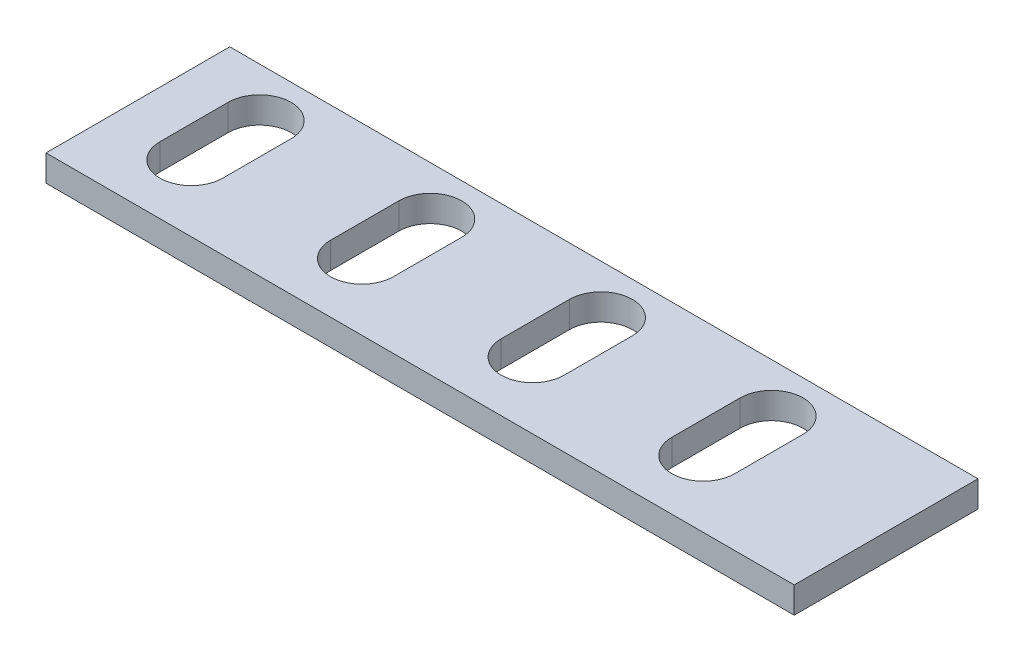
ISO-10303-21;
HEADER;
FILE_DESCRIPTION(('STEP AP214'),'2;1');
FILE_NAME('part.step','',(''),(''),'','','');
FILE_SCHEMA(('AUTOMOTIVE_DESIGN { 1 0 10303 214 1 1 1 1 }'));
ENDSEC;
DATA;
#1=APPLICATION_CONTEXT('core data for automotive mechanical design processes');
#2=APPLICATION_PROTOCOL_DEFINITION('international standard','automotive_design',2000,#1);
#3=PRODUCT_CONTEXT('',#1,'mechanical');
#4=PRODUCT('Part','Part','',(#3));
#5=PRODUCT_RELATED_PRODUCT_CATEGORY('part','',(#4));
#6=PRODUCT_DEFINITION_FORMATION('','',#4);
#7=PRODUCT_DEFINITION_CONTEXT('part definition',#1,'design');
#8=PRODUCT_DEFINITION('design','',#6,#7);
#9=PRODUCT_DEFINITION_SHAPE('','',#8);
#10=(LENGTH_UNIT() NAMED_UNIT(*) SI_UNIT(.MILLI.,.METRE.));
#11=(NAMED_UNIT(*) PLANE_ANGLE_UNIT() SI_UNIT($,.RADIAN.));
#12=(NAMED_UNIT(*) SI_UNIT($,.STERADIAN.) SOLID_ANGLE_UNIT());
#13=UNCERTAINTY_MEASURE_WITH_UNIT(LENGTH_MEASURE(1.E-05),#10,'distance_accuracy_value','');
#14=(GEOMETRIC_REPRESENTATION_CONTEXT(3) GLOBAL_UNCERTAINTY_ASSIGNED_CONTEXT((#13)) GLOBAL_UNIT_ASSIGNED_CONTEXT((#10,
#11,#12)) REPRESENTATION_CONTEXT('',''));
#15=CARTESIAN_POINT('',(0.,0.,0.));
#16=DIRECTION('',(0.,0.,1.));
#17=DIRECTION('',(1.,0.,0.));
#18=AXIS2_PLACEMENT_3D('',#15,#16,#17);
#19=CARTESIAN_POINT('',(0.,20.,0.));
#20=DIRECTION('',(0.,1.,0.));
#21=DIRECTION('',(0.,0.,1.));
#22=AXIS2_PLACEMENT_3D('',#19,#20,#21);
#23=PLANE('',#22);
#24=DIRECTION('',(0.,0.,1.));
#25=VECTOR('',#24,1.);
#26=CARTESIAN_POINT('',(-321.238685708937,20.,-92.0898814779407));
#27=LINE('',#26,#25);
#28=CARTESIAN_POINT('',(-321.238685708937,20.,-92.0898814779407));
#29=VERTEX_POINT('',#28);
#30=CARTESIAN_POINT('',(-321.238685708937,20.,47.9101185220593));
#31=VERTEX_POINT('',#30);
#32=EDGE_CURVE('E307',#29,#31,#27,.T.);
#33=ORIENTED_EDGE('',*,*,#32,.T.);
#34=DIRECTION('',(1.,0.,0.));
#35=VECTOR('',#34,1.);
#36=CARTESIAN_POINT('',(-321.238685708937,20.,47.9101185220593));
#37=LINE('',#36,#35);
#38=CARTESIAN_POINT('',(248.761314291063,20.,47.9101185220593));
#39=VERTEX_POINT('',#38);
#40=EDGE_CURVE('E310',#31,#39,#37,.T.);
#41=ORIENTED_EDGE('',*,*,#40,.T.);
#42=DIRECTION('',(0.,0.,-1.));
#43=VECTOR('',#42,1.);
#44=CARTESIAN_POINT('',(248.761314291063,20.,-92.0898814779407));
#45=LINE('',#44,#43);
#46=CARTESIAN_POINT('',(248.761314291063,20.,-92.0898814779407));
#47=VERTEX_POINT('',#46);
#48=EDGE_CURVE('E313',#39,#47,#45,.T.);
#49=ORIENTED_EDGE('',*,*,#48,.T.);
#50=DIRECTION('',(-1.,0.,0.));
#51=VECTOR('',#50,1.);
#52=CARTESIAN_POINT('',(-321.238685708937,20.,-92.0898814779407));
#53=LINE('',#52,#51);
#54=EDGE_CURVE('E315',#47,#29,#53,.T.);
#55=ORIENTED_EDGE('',*,*,#54,.T.);
#56=EDGE_LOOP('',(#33,#41,#49,#55));
#57=FACE_BOUND('',#56,.T.);
#58=DIRECTION('',(0.,0.,1.));
#59=VECTOR('',#58,1.);
#60=CARTESIAN_POINT('',(-285.238685708937,20.,-54.8236525172414));
#61=LINE('',#60,#59);
#62=CARTESIAN_POINT('',(-285.238685708937,20.,-54.8236525172414));
#63=VERTEX_POINT('',#62);
#64=CARTESIAN_POINT('',(-285.238685708937,20.,-2.82365251724137));
#65=VERTEX_POINT('',#64);
#66=EDGE_CURVE('E278',#63,#65,#61,.T.);
#67=ORIENTED_EDGE('',*,*,#66,.F.);
#68=CARTESIAN_POINT('',(-261.238685708937,20.,-54.8236525172414));
#69=DIRECTION('',(0.,1.,0.));
#70=DIRECTION('',(0.,0.,1.));
#71=AXIS2_PLACEMENT_3D('',#68,#69,#70);
#72=CIRCLE('',#71,24.);
#73=CARTESIAN_POINT('',(-237.238685708937,20.,-54.8236525172414));
#74=VERTEX_POINT('',#73);
#75=EDGE_CURVE('E276',#74,#63,#72,.T.);
#76=ORIENTED_EDGE('',*,*,#75,.F.);
#77=DIRECTION('',(0.,0.,-1.));
#78=VECTOR('',#77,1.);
#79=CARTESIAN_POINT('',(-237.238685708937,20.,-54.8236525172414));
#80=LINE('',#79,#78);
#81=CARTESIAN_POINT('',(-237.238685708937,20.,-2.82365251724136));
#82=VERTEX_POINT('',#81);
#83=EDGE_CURVE('E284',#82,#74,#80,.T.);
#84=ORIENTED_EDGE('',*,*,#83,.F.);
#85=CARTESIAN_POINT('',(-261.238685708937,20.,-2.82365251724136));
#86=DIRECTION('',(0.,1.,0.));
#87=DIRECTION('',(0.,0.,1.));
#88=AXIS2_PLACEMENT_3D('',#85,#86,#87);
#89=CIRCLE('',#88,24.);
#90=EDGE_CURVE('E281',#65,#82,#89,.T.);
#91=ORIENTED_EDGE('',*,*,#90,.F.);
#92=EDGE_LOOP('',(#67,#76,#84,#91));
#93=FACE_BOUND('',#92,.T.);
#94=DIRECTION('',(0.,0.,1.));
#95=VECTOR('',#94,1.);
#96=CARTESIAN_POINT('',(-155.238685708937,20.,-54.8236525172414));
#97=LINE('',#96,#95);
#98=CARTESIAN_POINT('',(-155.238685708937,20.,-54.8236525172414));
#99=VERTEX_POINT('',#98);
#100=CARTESIAN_POINT('',(-155.238685708937,20.,-2.82365251724136));
#101=VERTEX_POINT('',#100);
#102=EDGE_CURVE('E247',#99,#101,#97,.T.);
#103=ORIENTED_EDGE('',*,*,#102,.F.);
#104=CARTESIAN_POINT('',(-131.238685708937,20.,-54.8236525172414));
#105=DIRECTION('',(0.,1.,0.));
#106=DIRECTION('',(0.,0.,1.));
#107=AXIS2_PLACEMENT_3D('',#104,#105,#106);
#108=CIRCLE('',#107,23.9999999999999);
#109=CARTESIAN_POINT('',(-107.238685708937,20.,-54.8236525172414));
#110=VERTEX_POINT('',#109);
#111=EDGE_CURVE('E245',#110,#99,#108,.T.);
#112=ORIENTED_EDGE('',*,*,#111,.F.);
#113=DIRECTION('',(0.,0.,-1.));
#114=VECTOR('',#113,1.);
#115=CARTESIAN_POINT('',(-107.238685708937,20.,-54.8236525172414));
#116=LINE('',#115,#114);
#117=CARTESIAN_POINT('',(-107.238685708937,20.,-2.82365251724135));
#118=VERTEX_POINT('',#117);
#119=EDGE_CURVE('E253',#118,#110,#116,.T.);
#120=ORIENTED_EDGE('',*,*,#119,.F.);
#121=CARTESIAN_POINT('',(-131.238685708937,20.,-2.82365251724136));
#122=DIRECTION('',(0.,1.,0.));
#123=DIRECTION('',(0.,0.,1.));
#124=AXIS2_PLACEMENT_3D('',#121,#122,#123);
#125=CIRCLE('',#124,23.9999999999999);
#126=EDGE_CURVE('E250',#101,#118,#125,.T.);
#127=ORIENTED_EDGE('',*,*,#126,.F.);
#128=EDGE_LOOP('',(#103,#112,#120,#127));
#129=FACE_BOUND('',#128,.T.);
#130=DIRECTION('',(0.,0.,1.));
#131=VECTOR('',#130,1.);
#132=CARTESIAN_POINT('',(-25.2386857089368,20.,-54.8236525172414));
#133=LINE('',#132,#131);
#134=CARTESIAN_POINT('',(-25.2386857089368,20.,-54.8236525172414));
#135=VERTEX_POINT('',#134);
#136=CARTESIAN_POINT('',(-25.2386857089368,20.,-2.82365251724137));
#137=VERTEX_POINT('',#136);
#138=EDGE_CURVE('E216',#135,#137,#133,.T.);
#139=ORIENTED_EDGE('',*,*,#138,.F.);
#140=CARTESIAN_POINT('',(-1.23868570893687,20.,-54.8236525172414));
#141=DIRECTION('',(0.,1.,0.));
#142=DIRECTION('',(0.,0.,1.));
#143=AXIS2_PLACEMENT_3D('',#140,#141,#142);
#144=CIRCLE('',#143,24.);
#145=CARTESIAN_POINT('',(22.7613142910632,20.,-54.8236525172414));
#146=VERTEX_POINT('',#145);
#147=EDGE_CURVE('E214',#146,#135,#144,.T.);
#148=ORIENTED_EDGE('',*,*,#147,.F.);
#149=DIRECTION('',(0.,0.,-1.));
#150=VECTOR('',#149,1.);
#151=CARTESIAN_POINT('',(22.7613142910632,20.,-54.8236525172414));
#152=LINE('',#151,#150);
#153=CARTESIAN_POINT('',(22.7613142910632,20.,-2.82365251724136));
#154=VERTEX_POINT('',#153);
#155=EDGE_CURVE('E222',#154,#146,#152,.T.);
#156=ORIENTED_EDGE('',*,*,#155,.F.);
#157=CARTESIAN_POINT('',(-1.23868570893687,20.,-2.82365251724136));
#158=DIRECTION('',(0.,1.,0.));
#159=DIRECTION('',(0.,0.,1.));
#160=AXIS2_PLACEMENT_3D('',#157,#158,#159);
#161=CIRCLE('',#160,24.);
#162=EDGE_CURVE('E219',#137,#154,#161,.T.);
#163=ORIENTED_EDGE('',*,*,#162,.F.);
#164=EDGE_LOOP('',(#139,#148,#156,#163));
#165=FACE_BOUND('',#164,.T.);
#166=DIRECTION('',(0.,0.,1.));
#167=VECTOR('',#166,1.);
#168=CARTESIAN_POINT('',(104.761314291063,20.,-54.8236525172414));
#169=LINE('',#168,#167);
#170=CARTESIAN_POINT('',(104.761314291063,20.,-54.8236525172414));
#171=VERTEX_POINT('',#170);
#172=CARTESIAN_POINT('',(104.761314291063,20.,-2.82365251724137));
#173=VERTEX_POINT('',#172);
#174=EDGE_CURVE('E186',#171,#173,#169,.T.);
#175=ORIENTED_EDGE('',*,*,#174,.F.);
#176=CARTESIAN_POINT('',(128.761314291063,20.,-54.8236525172414));
#177=DIRECTION('',(0.,1.,0.));
#178=DIRECTION('',(0.,0.,1.));
#179=AXIS2_PLACEMENT_3D('',#176,#177,#178);
#180=CIRCLE('',#179,24.);
#181=CARTESIAN_POINT('',(152.761314291063,20.,-54.8236525172414));
#182=VERTEX_POINT('',#181);
#183=EDGE_CURVE('E178',#182,#171,#180,.T.);
#184=ORIENTED_EDGE('',*,*,#183,.F.);
#185=DIRECTION('',(0.,0.,-1.));
#186=VECTOR('',#185,1.);
#187=CARTESIAN_POINT('',(152.761314291063,20.,-54.8236525172414));
#188=LINE('',#187,#186);
#189=CARTESIAN_POINT('',(152.761314291063,20.,-2.82365251724136));
#190=VERTEX_POINT('',#189);
#191=EDGE_CURVE('E200',#190,#182,#188,.T.);
#192=ORIENTED_EDGE('',*,*,#191,.F.);
#193=CARTESIAN_POINT('',(128.761314291063,20.,-2.82365251724136));
#194=DIRECTION('',(0.,1.,0.));
#195=DIRECTION('',(0.,0.,1.));
#196=AXIS2_PLACEMENT_3D('',#193,#194,#195);
#197=CIRCLE('',#196,24.);
#198=EDGE_CURVE('E198',#173,#190,#197,.T.);
#199=ORIENTED_EDGE('',*,*,#198,.F.);
#200=EDGE_LOOP('',(#175,#184,#192,#199));
#201=FACE_BOUND('',#200,.T.);
#202=ADVANCED_FACE('F41',(#57,#93,#129,#165,#201),#23,.T.);
#203=CARTESIAN_POINT('',(0.,0.,0.));
#204=DIRECTION('',(0.,1.,0.));
#205=DIRECTION('',(0.,0.,1.));
#206=AXIS2_PLACEMENT_3D('',#203,#204,#205);
#207=PLANE('',#206);
#208=CARTESIAN_POINT('',(-1.23868570893687,0.,-54.8236525172414));
#209=DIRECTION('',(0.,1.,0.));
#210=DIRECTION('',(0.,0.,1.));
#211=AXIS2_PLACEMENT_3D('',#208,#209,#210);
#212=CIRCLE('',#211,24.);
#213=CARTESIAN_POINT('',(22.7613142910632,0.,-54.8236525172414));
#214=VERTEX_POINT('',#213);
#215=CARTESIAN_POINT('',(-25.2386857089368,0.,-54.8236525172414));
#216=VERTEX_POINT('',#215);
#217=EDGE_CURVE('E194',#214,#216,#212,.T.);
#218=ORIENTED_EDGE('',*,*,#217,.T.);
#219=DIRECTION('',(0.,0.,1.));
#220=VECTOR('',#219,1.);
#221=CARTESIAN_POINT('',(-25.2386857089368,0.,-54.8236525172414));
#222=LINE('',#221,#220);
#223=CARTESIAN_POINT('',(-25.2386857089368,0.,-2.82365251724137));
#224=VERTEX_POINT('',#223);
#225=EDGE_CURVE('E227',#216,#224,#222,.T.);
#226=ORIENTED_EDGE('',*,*,#225,.T.);
#227=CARTESIAN_POINT('',(-1.23868570893687,0.,-2.82365251724136));
#228=DIRECTION('',(0.,1.,0.));
#229=DIRECTION('',(0.,0.,1.));
#230=AXIS2_PLACEMENT_3D('',#227,#228,#229);
#231=CIRCLE('',#230,24.);
#232=CARTESIAN_POINT('',(22.7613142910632,0.,-2.82365251724136));
#233=VERTEX_POINT('',#232);
#234=EDGE_CURVE('E230',#224,#233,#231,.T.);
#235=ORIENTED_EDGE('',*,*,#234,.T.);
#236=DIRECTION('',(0.,0.,-1.));
#237=VECTOR('',#236,1.);
#238=CARTESIAN_POINT('',(22.7613142910632,0.,-54.8236525172414));
#239=LINE('',#238,#237);
#240=EDGE_CURVE('E217',#233,#214,#239,.T.);
#241=ORIENTED_EDGE('',*,*,#240,.T.);
#242=EDGE_LOOP('',(#218,#226,#235,#241));
#243=FACE_BOUND('',#242,.T.);
#244=CARTESIAN_POINT('',(-261.238685708937,0.,-54.8236525172414));
#245=DIRECTION('',(0.,1.,0.));
#246=DIRECTION('',(0.,0.,1.));
#247=AXIS2_PLACEMENT_3D('',#244,#245,#246);
#248=CIRCLE('',#247,24.);
#249=CARTESIAN_POINT('',(-237.238685708937,0.,-54.8236525172414));
#250=VERTEX_POINT('',#249);
#251=CARTESIAN_POINT('',(-285.238685708937,0.,-54.8236525172414));
#252=VERTEX_POINT('',#251);
#253=EDGE_CURVE('E275',#250,#252,#248,.T.);
#254=ORIENTED_EDGE('',*,*,#253,.T.);
#255=DIRECTION('',(0.,0.,1.));
#256=VECTOR('',#255,1.);
#257=CARTESIAN_POINT('',(-285.238685708937,0.,-54.8236525172414));
#258=LINE('',#257,#256);
#259=CARTESIAN_POINT('',(-285.238685708937,0.,-2.82365251724137));
#260=VERTEX_POINT('',#259);
#261=EDGE_CURVE('E289',#252,#260,#258,.T.);
#262=ORIENTED_EDGE('',*,*,#261,.T.);
#263=CARTESIAN_POINT('',(-261.238685708937,0.,-2.82365251724136));
#264=DIRECTION('',(0.,1.,0.));
#265=DIRECTION('',(0.,0.,1.));
#266=AXIS2_PLACEMENT_3D('',#263,#264,#265);
#267=CIRCLE('',#266,24.);
#268=CARTESIAN_POINT('',(-237.238685708937,0.,-2.82365251724136));
#269=VERTEX_POINT('',#268);
#270=EDGE_CURVE('E292',#260,#269,#267,.T.);
#271=ORIENTED_EDGE('',*,*,#270,.T.);
#272=DIRECTION('',(0.,0.,-1.));
#273=VECTOR('',#272,1.);
#274=CARTESIAN_POINT('',(-237.238685708937,0.,-54.8236525172414));
#275=LINE('',#274,#273);
#276=EDGE_CURVE('E279',#269,#250,#275,.T.);
#277=ORIENTED_EDGE('',*,*,#276,.T.);
#278=EDGE_LOOP('',(#254,#262,#271,#277));
#279=FACE_BOUND('',#278,.T.);
#280=DIRECTION('',(0.,0.,1.));
#281=VECTOR('',#280,1.);
#282=CARTESIAN_POINT('',(-321.238685708937,0.,-92.0898814779407));
#283=LINE('',#282,#281);
#284=CARTESIAN_POINT('',(-321.238685708937,0.,-92.0898814779407));
#285=VERTEX_POINT('',#284);
#286=CARTESIAN_POINT('',(-321.238685708937,0.,47.9101185220593));
#287=VERTEX_POINT('',#286);
#288=EDGE_CURVE('E306',#285,#287,#283,.T.);
#289=ORIENTED_EDGE('',*,*,#288,.F.);
#290=DIRECTION('',(-1.,0.,0.));
#291=VECTOR('',#290,1.);
#292=CARTESIAN_POINT('',(-321.238685708937,0.,-92.0898814779407));
#293=LINE('',#292,#291);
#294=CARTESIAN_POINT('',(248.761314291063,0.,-92.0898814779407));
#295=VERTEX_POINT('',#294);
#296=EDGE_CURVE('E311',#295,#285,#293,.T.);
#297=ORIENTED_EDGE('',*,*,#296,.F.);
#298=DIRECTION('',(0.,0.,-1.));
#299=VECTOR('',#298,1.);
#300=CARTESIAN_POINT('',(248.761314291063,0.,-92.0898814779407));
#301=LINE('',#300,#299);
#302=CARTESIAN_POINT('',(248.761314291063,0.,47.9101185220593));
#303=VERTEX_POINT('',#302);
#304=EDGE_CURVE('E322',#303,#295,#301,.T.);
#305=ORIENTED_EDGE('',*,*,#304,.F.);
#306=DIRECTION('',(1.,0.,0.));
#307=VECTOR('',#306,1.);
#308=CARTESIAN_POINT('',(-321.238685708937,0.,47.9101185220593));
#309=LINE('',#308,#307);
#310=EDGE_CURVE('E320',#287,#303,#309,.T.);
#311=ORIENTED_EDGE('',*,*,#310,.F.);
#312=EDGE_LOOP('',(#289,#297,#305,#311));
#313=FACE_BOUND('',#312,.T.);
#314=CARTESIAN_POINT('',(-131.238685708937,0.,-54.8236525172414));
#315=DIRECTION('',(0.,1.,0.));
#316=DIRECTION('',(0.,0.,1.));
#317=AXIS2_PLACEMENT_3D('',#314,#315,#316);
#318=CIRCLE('',#317,23.9999999999999);
#319=CARTESIAN_POINT('',(-107.238685708937,0.,-54.8236525172414));
#320=VERTEX_POINT('',#319);
#321=CARTESIAN_POINT('',(-155.238685708937,0.,-54.8236525172414));
#322=VERTEX_POINT('',#321);
#323=EDGE_CURVE('E244',#320,#322,#318,.T.);
#324=ORIENTED_EDGE('',*,*,#323,.T.);
#325=DIRECTION('',(0.,0.,1.));
#326=VECTOR('',#325,1.);
#327=CARTESIAN_POINT('',(-155.238685708937,0.,-54.8236525172414));
#328=LINE('',#327,#326);
#329=CARTESIAN_POINT('',(-155.238685708937,0.,-2.82365251724136));
#330=VERTEX_POINT('',#329);
#331=EDGE_CURVE('E258',#322,#330,#328,.T.);
#332=ORIENTED_EDGE('',*,*,#331,.T.);
#333=CARTESIAN_POINT('',(-131.238685708937,0.,-2.82365251724136));
#334=DIRECTION('',(0.,1.,0.));
#335=DIRECTION('',(0.,0.,1.));
#336=AXIS2_PLACEMENT_3D('',#333,#334,#335);
#337=CIRCLE('',#336,23.9999999999999);
#338=CARTESIAN_POINT('',(-107.238685708937,0.,-2.82365251724135));
#339=VERTEX_POINT('',#338);
#340=EDGE_CURVE('E261',#330,#339,#337,.T.);
#341=ORIENTED_EDGE('',*,*,#340,.T.);
#342=DIRECTION('',(0.,0.,-1.));
#343=VECTOR('',#342,1.);
#344=CARTESIAN_POINT('',(-107.238685708937,0.,-54.8236525172414));
#345=LINE('',#344,#343);
#346=EDGE_CURVE('E248',#339,#320,#345,.T.);
#347=ORIENTED_EDGE('',*,*,#346,.T.);
#348=EDGE_LOOP('',(#324,#332,#341,#347));
#349=FACE_BOUND('',#348,.T.);
#350=CARTESIAN_POINT('',(128.761314291063,0.,-54.8236525172414));
#351=DIRECTION('',(0.,1.,0.));
#352=DIRECTION('',(0.,0.,1.));
#353=AXIS2_PLACEMENT_3D('',#350,#351,#352);
#354=CIRCLE('',#353,24.);
#355=CARTESIAN_POINT('',(152.761314291063,0.,-54.8236525172414));
#356=VERTEX_POINT('',#355);
#357=CARTESIAN_POINT('',(104.761314291063,0.,-54.8236525172414));
#358=VERTEX_POINT('',#357);
#359=EDGE_CURVE('E64',#356,#358,#354,.T.);
#360=ORIENTED_EDGE('',*,*,#359,.T.);
#361=DIRECTION('',(0.,0.,1.));
#362=VECTOR('',#361,1.);
#363=CARTESIAN_POINT('',(104.761314291063,0.,-54.8236525172414));
#364=LINE('',#363,#362);
#365=CARTESIAN_POINT('',(104.761314291063,0.,-2.82365251724137));
#366=VERTEX_POINT('',#365);
#367=EDGE_CURVE('E193',#358,#366,#364,.T.);
#368=ORIENTED_EDGE('',*,*,#367,.T.);
#369=CARTESIAN_POINT('',(128.761314291063,0.,-2.82365251724136));
#370=DIRECTION('',(0.,1.,0.));
#371=DIRECTION('',(0.,0.,1.));
#372=AXIS2_PLACEMENT_3D('',#369,#370,#371);
#373=CIRCLE('',#372,24.);
#374=CARTESIAN_POINT('',(152.761314291063,0.,-2.82365251724136));
#375=VERTEX_POINT('',#374);
#376=EDGE_CURVE('E206',#366,#375,#373,.T.);
#377=ORIENTED_EDGE('',*,*,#376,.T.);
#378=DIRECTION('',(0.,0.,-1.));
#379=VECTOR('',#378,1.);
#380=CARTESIAN_POINT('',(152.761314291063,0.,-54.8236525172414));
#381=LINE('',#380,#379);
#382=EDGE_CURVE('E187',#375,#356,#381,.T.);
#383=ORIENTED_EDGE('',*,*,#382,.T.);
#384=EDGE_LOOP('',(#360,#368,#377,#383));
#385=FACE_BOUND('',#384,.T.);
#386=ADVANCED_FACE('F340',(#243,#279,#313,#349,#385),#207,.F.);
#387=CARTESIAN_POINT('',(-321.238685708937,20.,-92.0898814779407));
#388=DIRECTION('',(1.,0.,0.));
#389=DIRECTION('',(0.,0.,-1.));
#390=AXIS2_PLACEMENT_3D('',#387,#388,#389);
#391=PLANE('',#390);
#392=ORIENTED_EDGE('',*,*,#288,.T.);
#393=DIRECTION('',(0.,-1.,0.));
#394=VECTOR('',#393,1.);
#395=CARTESIAN_POINT('',(-321.238685708937,20.,47.9101185220593));
#396=LINE('',#395,#394);
#397=EDGE_CURVE('E11',#31,#287,#396,.T.);
#398=ORIENTED_EDGE('',*,*,#397,.F.);
#399=ORIENTED_EDGE('',*,*,#32,.F.);
#400=DIRECTION('',(0.,-1.,0.));
#401=VECTOR('',#400,1.);
#402=CARTESIAN_POINT('',(-321.238685708937,20.,-92.0898814779407));
#403=LINE('',#402,#401);
#404=EDGE_CURVE('E317',#29,#285,#403,.T.);
#405=ORIENTED_EDGE('',*,*,#404,.T.);
#406=EDGE_LOOP('',(#392,#398,#399,#405));
#407=FACE_BOUND('',#406,.T.);
#408=ADVANCED_FACE('F43',(#407),#391,.F.);
#409=CARTESIAN_POINT('',(-321.238685708937,20.,47.9101185220593));
#410=DIRECTION('',(0.,0.,-1.));
#411=DIRECTION('',(-1.,0.,0.));
#412=AXIS2_PLACEMENT_3D('',#409,#410,#411);
#413=PLANE('',#412);
#414=ORIENTED_EDGE('',*,*,#310,.T.);
#415=DIRECTION('',(0.,-1.,0.));
#416=VECTOR('',#415,1.);
#417=CARTESIAN_POINT('',(248.761314291063,20.,47.9101185220593));
#418=LINE('',#417,#416);
#419=EDGE_CURVE('E49',#39,#303,#418,.T.);
#420=ORIENTED_EDGE('',*,*,#419,.F.);
#421=ORIENTED_EDGE('',*,*,#40,.F.);
#422=ORIENTED_EDGE('',*,*,#397,.T.);
#423=EDGE_LOOP('',(#414,#420,#421,#422));
#424=FACE_BOUND('',#423,.T.);
#425=ADVANCED_FACE('F351',(#424),#413,.F.);
#426=CARTESIAN_POINT('',(248.761314291063,20.,-92.0898814779407));
#427=DIRECTION('',(-1.,0.,0.));
#428=DIRECTION('',(0.,0.,1.));
#429=AXIS2_PLACEMENT_3D('',#426,#427,#428);
#430=PLANE('',#429);
#431=ORIENTED_EDGE('',*,*,#304,.T.);
#432=DIRECTION('',(0.,-1.,0.));
#433=VECTOR('',#432,1.);
#434=CARTESIAN_POINT('',(248.761314291063,20.,-92.0898814779407));
#435=LINE('',#434,#433);
#436=EDGE_CURVE('E327',#47,#295,#435,.T.);
#437=ORIENTED_EDGE('',*,*,#436,.F.);
#438=ORIENTED_EDGE('',*,*,#48,.F.);
#439=ORIENTED_EDGE('',*,*,#419,.T.);
#440=EDGE_LOOP('',(#431,#437,#438,#439));
#441=FACE_BOUND('',#440,.T.);
#442=ADVANCED_FACE('F334',(#441),#430,.F.);
#443=CARTESIAN_POINT('',(-321.238685708937,20.,-92.0898814779407));
#444=DIRECTION('',(0.,0.,1.));
#445=DIRECTION('',(1.,0.,0.));
#446=AXIS2_PLACEMENT_3D('',#443,#444,#445);
#447=PLANE('',#446);
#448=ORIENTED_EDGE('',*,*,#296,.T.);
#449=ORIENTED_EDGE('',*,*,#404,.F.);
#450=ORIENTED_EDGE('',*,*,#54,.F.);
#451=ORIENTED_EDGE('',*,*,#436,.T.);
#452=EDGE_LOOP('',(#448,#449,#450,#451));
#453=FACE_BOUND('',#452,.T.);
#454=ADVANCED_FACE('F344',(#453),#447,.F.);
#455=CARTESIAN_POINT('',(-261.238685708937,20.,-54.8236525172414));
#456=DIRECTION('',(0.,-1.,0.));
#457=DIRECTION('',(0.,0.,-1.));
#458=AXIS2_PLACEMENT_3D('',#455,#456,#457);
#459=CYLINDRICAL_SURFACE('',#458,24.);
#460=ORIENTED_EDGE('',*,*,#253,.F.);
#461=DIRECTION('',(0.,-1.,0.));
#462=VECTOR('',#461,1.);
#463=CARTESIAN_POINT('',(-237.238685708937,20.,-54.8236525172414));
#464=LINE('',#463,#462);
#465=EDGE_CURVE('E286',#74,#250,#464,.T.);
#466=ORIENTED_EDGE('',*,*,#465,.F.);
#467=ORIENTED_EDGE('',*,*,#75,.T.);
#468=DIRECTION('',(0.,-1.,0.));
#469=VECTOR('',#468,1.);
#470=CARTESIAN_POINT('',(-285.238685708937,20.,-54.8236525172414));
#471=LINE('',#470,#469);
#472=EDGE_CURVE('E303',#63,#252,#471,.T.);
#473=ORIENTED_EDGE('',*,*,#472,.T.);
#474=EDGE_LOOP('',(#460,#466,#467,#473));
#475=FACE_BOUND('',#474,.T.);
#476=ADVANCED_FACE('F366',(#475),#459,.F.);
#477=CARTESIAN_POINT('',(-285.238685708937,20.,-54.8236525172414));
#478=DIRECTION('',(1.,0.,0.));
#479=DIRECTION('',(0.,0.,-1.));
#480=AXIS2_PLACEMENT_3D('',#477,#478,#479);
#481=PLANE('',#480);
#482=ORIENTED_EDGE('',*,*,#261,.F.);
#483=ORIENTED_EDGE('',*,*,#472,.F.);
#484=ORIENTED_EDGE('',*,*,#66,.T.);
#485=DIRECTION('',(0.,-1.,0.));
#486=VECTOR('',#485,1.);
#487=CARTESIAN_POINT('',(-285.238685708937,20.,-2.82365251724137));
#488=LINE('',#487,#486);
#489=EDGE_CURVE('E301',#65,#260,#488,.T.);
#490=ORIENTED_EDGE('',*,*,#489,.T.);
#491=EDGE_LOOP('',(#482,#483,#484,#490));
#492=FACE_BOUND('',#491,.T.);
#493=ADVANCED_FACE('F373',(#492),#481,.T.);
#494=CARTESIAN_POINT('',(-261.238685708937,20.,-2.82365251724136));
#495=DIRECTION('',(0.,-1.,0.));
#496=DIRECTION('',(0.,0.,-1.));
#497=AXIS2_PLACEMENT_3D('',#494,#495,#496);
#498=CYLINDRICAL_SURFACE('',#497,24.);
#499=ORIENTED_EDGE('',*,*,#270,.F.);
#500=ORIENTED_EDGE('',*,*,#489,.F.);
#501=ORIENTED_EDGE('',*,*,#90,.T.);
#502=DIRECTION('',(0.,-1.,0.));
#503=VECTOR('',#502,1.);
#504=CARTESIAN_POINT('',(-237.238685708937,20.,-2.82365251724136));
#505=LINE('',#504,#503);
#506=EDGE_CURVE('E299',#82,#269,#505,.T.);
#507=ORIENTED_EDGE('',*,*,#506,.T.);
#508=EDGE_LOOP('',(#499,#500,#501,#507));
#509=FACE_BOUND('',#508,.T.);
#510=ADVANCED_FACE('F378',(#509),#498,.F.);
#511=CARTESIAN_POINT('',(-237.238685708937,20.,-54.8236525172414));
#512=DIRECTION('',(-1.,0.,0.));
#513=DIRECTION('',(0.,0.,1.));
#514=AXIS2_PLACEMENT_3D('',#511,#512,#513);
#515=PLANE('',#514);
#516=ORIENTED_EDGE('',*,*,#276,.F.);
#517=ORIENTED_EDGE('',*,*,#506,.F.);
#518=ORIENTED_EDGE('',*,*,#83,.T.);
#519=ORIENTED_EDGE('',*,*,#465,.T.);
#520=EDGE_LOOP('',(#516,#517,#518,#519));
#521=FACE_BOUND('',#520,.T.);
#522=ADVANCED_FACE('F386',(#521),#515,.T.);
#523=CARTESIAN_POINT('',(-131.238685708937,20.,-54.8236525172414));
#524=DIRECTION('',(0.,-1.,0.));
#525=DIRECTION('',(0.,0.,-1.));
#526=AXIS2_PLACEMENT_3D('',#523,#524,#525);
#527=CYLINDRICAL_SURFACE('',#526,23.9999999999999);
#528=ORIENTED_EDGE('',*,*,#323,.F.);
#529=DIRECTION('',(0.,-1.,0.));
#530=VECTOR('',#529,1.);
#531=CARTESIAN_POINT('',(-107.238685708937,20.,-54.8236525172414));
#532=LINE('',#531,#530);
#533=EDGE_CURVE('E255',#110,#320,#532,.T.);
#534=ORIENTED_EDGE('',*,*,#533,.F.);
#535=ORIENTED_EDGE('',*,*,#111,.T.);
#536=DIRECTION('',(0.,-1.,0.));
#537=VECTOR('',#536,1.);
#538=CARTESIAN_POINT('',(-155.238685708937,20.,-54.8236525172414));
#539=LINE('',#538,#537);
#540=EDGE_CURVE('E272',#99,#322,#539,.T.);
#541=ORIENTED_EDGE('',*,*,#540,.T.);
#542=EDGE_LOOP('',(#528,#534,#535,#541));
#543=FACE_BOUND('',#542,.T.);
#544=ADVANCED_FACE('F440',(#543),#527,.F.);
#545=CARTESIAN_POINT('',(-155.238685708937,20.,-54.8236525172414));
#546=DIRECTION('',(1.,0.,0.));
#547=DIRECTION('',(0.,0.,-1.));
#548=AXIS2_PLACEMENT_3D('',#545,#546,#547);
#549=PLANE('',#548);
#550=ORIENTED_EDGE('',*,*,#331,.F.);
#551=ORIENTED_EDGE('',*,*,#540,.F.);
#552=ORIENTED_EDGE('',*,*,#102,.T.);
#553=DIRECTION('',(0.,-1.,0.));
#554=VECTOR('',#553,1.);
#555=CARTESIAN_POINT('',(-155.238685708937,20.,-2.82365251724136));
#556=LINE('',#555,#554);
#557=EDGE_CURVE('E270',#101,#330,#556,.T.);
#558=ORIENTED_EDGE('',*,*,#557,.T.);
#559=EDGE_LOOP('',(#550,#551,#552,#558));
#560=FACE_BOUND('',#559,.T.);
#561=ADVANCED_FACE('F436',(#560),#549,.T.);
#562=CARTESIAN_POINT('',(-131.238685708937,20.,-2.82365251724136));
#563=DIRECTION('',(0.,-1.,0.));
#564=DIRECTION('',(0.,0.,-1.));
#565=AXIS2_PLACEMENT_3D('',#562,#563,#564);
#566=CYLINDRICAL_SURFACE('',#565,23.9999999999999);
#567=ORIENTED_EDGE('',*,*,#340,.F.);
#568=ORIENTED_EDGE('',*,*,#557,.F.);
#569=ORIENTED_EDGE('',*,*,#126,.T.);
#570=DIRECTION('',(0.,-1.,0.));
#571=VECTOR('',#570,1.);
#572=CARTESIAN_POINT('',(-107.238685708937,20.,-2.82365251724135));
#573=LINE('',#572,#571);
#574=EDGE_CURVE('E268',#118,#339,#573,.T.);
#575=ORIENTED_EDGE('',*,*,#574,.T.);
#576=EDGE_LOOP('',(#567,#568,#569,#575));
#577=FACE_BOUND('',#576,.T.);
#578=ADVANCED_FACE('F432',(#577),#566,.F.);
#579=CARTESIAN_POINT('',(-107.238685708937,20.,-54.8236525172414));
#580=DIRECTION('',(-1.,0.,0.));
#581=DIRECTION('',(0.,0.,1.));
#582=AXIS2_PLACEMENT_3D('',#579,#580,#581);
#583=PLANE('',#582);
#584=ORIENTED_EDGE('',*,*,#346,.F.);
#585=ORIENTED_EDGE('',*,*,#574,.F.);
#586=ORIENTED_EDGE('',*,*,#119,.T.);
#587=ORIENTED_EDGE('',*,*,#533,.T.);
#588=EDGE_LOOP('',(#584,#585,#586,#587));
#589=FACE_BOUND('',#588,.T.);
#590=ADVANCED_FACE('F429',(#589),#583,.T.);
#591=CARTESIAN_POINT('',(-1.23868570893687,20.,-54.8236525172414));
#592=DIRECTION('',(0.,-1.,0.));
#593=DIRECTION('',(0.,0.,-1.));
#594=AXIS2_PLACEMENT_3D('',#591,#592,#593);
#595=CYLINDRICAL_SURFACE('',#594,24.);
#596=ORIENTED_EDGE('',*,*,#217,.F.);
#597=DIRECTION('',(0.,-1.,0.));
#598=VECTOR('',#597,1.);
#599=CARTESIAN_POINT('',(22.7613142910632,20.,-54.8236525172414));
#600=LINE('',#599,#598);
#601=EDGE_CURVE('E224',#146,#214,#600,.T.);
#602=ORIENTED_EDGE('',*,*,#601,.F.);
#603=ORIENTED_EDGE('',*,*,#147,.T.);
#604=DIRECTION('',(0.,-1.,0.));
#605=VECTOR('',#604,1.);
#606=CARTESIAN_POINT('',(-25.2386857089368,20.,-54.8236525172414));
#607=LINE('',#606,#605);
#608=EDGE_CURVE('E241',#135,#216,#607,.T.);
#609=ORIENTED_EDGE('',*,*,#608,.T.);
#610=EDGE_LOOP('',(#596,#602,#603,#609));
#611=FACE_BOUND('',#610,.T.);
#612=ADVANCED_FACE('F411',(#611),#595,.F.);
#613=CARTESIAN_POINT('',(-25.2386857089368,20.,-54.8236525172414));
#614=DIRECTION('',(1.,0.,0.));
#615=DIRECTION('',(0.,0.,-1.));
#616=AXIS2_PLACEMENT_3D('',#613,#614,#615);
#617=PLANE('',#616);
#618=ORIENTED_EDGE('',*,*,#225,.F.);
#619=ORIENTED_EDGE('',*,*,#608,.F.);
#620=ORIENTED_EDGE('',*,*,#138,.T.);
#621=DIRECTION('',(0.,-1.,0.));
#622=VECTOR('',#621,1.);
#623=CARTESIAN_POINT('',(-25.2386857089368,20.,-2.82365251724137));
#624=LINE('',#623,#622);
#625=EDGE_CURVE('E239',#137,#224,#624,.T.);
#626=ORIENTED_EDGE('',*,*,#625,.T.);
#627=EDGE_LOOP('',(#618,#619,#620,#626));
#628=FACE_BOUND('',#627,.T.);
#629=ADVANCED_FACE('F405',(#628),#617,.T.);
#630=CARTESIAN_POINT('',(-1.23868570893687,20.,-2.82365251724136));
#631=DIRECTION('',(0.,-1.,0.));
#632=DIRECTION('',(0.,0.,-1.));
#633=AXIS2_PLACEMENT_3D('',#630,#631,#632);
#634=CYLINDRICAL_SURFACE('',#633,24.);
#635=ORIENTED_EDGE('',*,*,#234,.F.);
#636=ORIENTED_EDGE('',*,*,#625,.F.);
#637=ORIENTED_EDGE('',*,*,#162,.T.);
#638=DIRECTION('',(0.,-1.,0.));
#639=VECTOR('',#638,1.);
#640=CARTESIAN_POINT('',(22.7613142910632,20.,-2.82365251724136));
#641=LINE('',#640,#639);
#642=EDGE_CURVE('E237',#154,#233,#641,.T.);
#643=ORIENTED_EDGE('',*,*,#642,.T.);
#644=EDGE_LOOP('',(#635,#636,#637,#643));
#645=FACE_BOUND('',#644,.T.);
#646=ADVANCED_FACE('F408',(#645),#634,.F.);
#647=CARTESIAN_POINT('',(22.7613142910632,20.,-54.8236525172414));
#648=DIRECTION('',(-1.,0.,0.));
#649=DIRECTION('',(0.,0.,1.));
#650=AXIS2_PLACEMENT_3D('',#647,#648,#649);
#651=PLANE('',#650);
#652=ORIENTED_EDGE('',*,*,#240,.F.);
#653=ORIENTED_EDGE('',*,*,#642,.F.);
#654=ORIENTED_EDGE('',*,*,#155,.T.);
#655=ORIENTED_EDGE('',*,*,#601,.T.);
#656=EDGE_LOOP('',(#652,#653,#654,#655));
#657=FACE_BOUND('',#656,.T.);
#658=ADVANCED_FACE('F414',(#657),#651,.T.);
#659=CARTESIAN_POINT('',(128.761314291063,20.,-54.8236525172414));
#660=DIRECTION('',(0.,-1.,0.));
#661=DIRECTION('',(0.,0.,-1.));
#662=AXIS2_PLACEMENT_3D('',#659,#660,#661);
#663=CYLINDRICAL_SURFACE('',#662,24.);
#664=ORIENTED_EDGE('',*,*,#359,.F.);
#665=DIRECTION('',(0.,-1.,0.));
#666=VECTOR('',#665,1.);
#667=CARTESIAN_POINT('',(152.761314291063,20.,-54.8236525172414));
#668=LINE('',#667,#666);
#669=EDGE_CURVE('E182',#182,#356,#668,.T.);
#670=ORIENTED_EDGE('',*,*,#669,.F.);
#671=ORIENTED_EDGE('',*,*,#183,.T.);
#672=DIRECTION('',(0.,-1.,0.));
#673=VECTOR('',#672,1.);
#674=CARTESIAN_POINT('',(104.761314291063,20.,-54.8236525172414));
#675=LINE('',#674,#673);
#676=EDGE_CURVE('E181',#171,#358,#675,.T.);
#677=ORIENTED_EDGE('',*,*,#676,.T.);
#678=EDGE_LOOP('',(#664,#670,#671,#677));
#679=FACE_BOUND('',#678,.T.);
#680=ADVANCED_FACE('F180',(#679),#663,.F.);
#681=CARTESIAN_POINT('',(104.761314291063,20.,-54.8236525172414));
#682=DIRECTION('',(1.,0.,0.));
#683=DIRECTION('',(0.,0.,-1.));
#684=AXIS2_PLACEMENT_3D('',#681,#682,#683);
#685=PLANE('',#684);
#686=ORIENTED_EDGE('',*,*,#367,.F.);
#687=ORIENTED_EDGE('',*,*,#676,.F.);
#688=ORIENTED_EDGE('',*,*,#174,.T.);
#689=DIRECTION('',(0.,-1.,0.));
#690=VECTOR('',#689,1.);
#691=CARTESIAN_POINT('',(104.761314291063,20.,-2.82365251724137));
#692=LINE('',#691,#690);
#693=EDGE_CURVE('E195',#173,#366,#692,.T.);
#694=ORIENTED_EDGE('',*,*,#693,.T.);
#695=EDGE_LOOP('',(#686,#687,#688,#694));
#696=FACE_BOUND('',#695,.T.);
#697=ADVANCED_FACE('F190',(#696),#685,.T.);
#698=CARTESIAN_POINT('',(128.761314291063,20.,-2.82365251724136));
#699=DIRECTION('',(0.,-1.,0.));
#700=DIRECTION('',(0.,0.,-1.));
#701=AXIS2_PLACEMENT_3D('',#698,#699,#700);
#702=CYLINDRICAL_SURFACE('',#701,24.);
#703=ORIENTED_EDGE('',*,*,#376,.F.);
#704=ORIENTED_EDGE('',*,*,#693,.F.);
#705=ORIENTED_EDGE('',*,*,#198,.T.);
#706=DIRECTION('',(0.,-1.,0.));
#707=VECTOR('',#706,1.);
#708=CARTESIAN_POINT('',(152.761314291063,20.,-2.82365251724136));
#709=LINE('',#708,#707);
#710=EDGE_CURVE('E56',#190,#375,#709,.T.);
#711=ORIENTED_EDGE('',*,*,#710,.T.);
#712=EDGE_LOOP('',(#703,#704,#705,#711));
#713=FACE_BOUND('',#712,.T.);
#714=ADVANCED_FACE('F506',(#713),#702,.F.);
#715=CARTESIAN_POINT('',(152.761314291063,20.,-54.8236525172414));
#716=DIRECTION('',(-1.,0.,0.));
#717=DIRECTION('',(0.,0.,1.));
#718=AXIS2_PLACEMENT_3D('',#715,#716,#717);
#719=PLANE('',#718);
#720=ORIENTED_EDGE('',*,*,#382,.F.);
#721=ORIENTED_EDGE('',*,*,#710,.F.);
#722=ORIENTED_EDGE('',*,*,#191,.T.);
#723=ORIENTED_EDGE('',*,*,#669,.T.);
#724=EDGE_LOOP('',(#720,#721,#722,#723));
#725=FACE_BOUND('',#724,.T.);
#726=ADVANCED_FACE('F515',(#725),#719,.T.);
#727=CLOSED_SHELL('',(#202,#386,#408,#425,#442,#454,#476,#493,#510,#522,#544,#561,#578,#590,
#612,#629,#646,#658,#680,#697,#714,#726));
#728=MANIFOLD_SOLID_BREP('B2',#727);
#729=ADVANCED_BREP_SHAPE_REPRESENTATION('',(#18,#728),#14);
#730=SHAPE_DEFINITION_REPRESENTATION(#9,#729);
ENDSEC;
END-ISO-10303-21;
